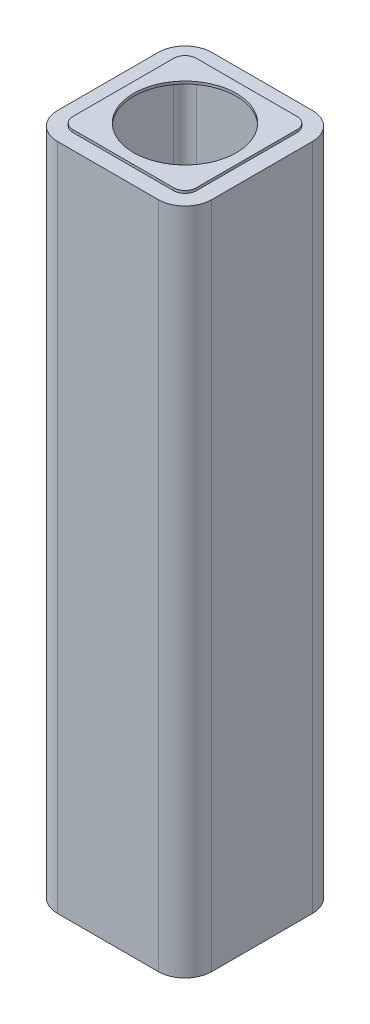
ISO-10303-21;
HEADER;
FILE_DESCRIPTION(('STEP AP214'),'2;1');
FILE_NAME('part.step','',(''),(''),'','','');
FILE_SCHEMA(('AUTOMOTIVE_DESIGN { 1 0 10303 214 1 1 1 1 }'));
ENDSEC;
DATA;
#1=APPLICATION_CONTEXT('core data for automotive mechanical design processes');
#2=APPLICATION_PROTOCOL_DEFINITION('international standard','automotive_design',2000,#1);
#3=PRODUCT_CONTEXT('',#1,'mechanical');
#4=PRODUCT('Part','Part','',(#3));
#5=PRODUCT_RELATED_PRODUCT_CATEGORY('part','',(#4));
#6=PRODUCT_DEFINITION_FORMATION('','',#4);
#7=PRODUCT_DEFINITION_CONTEXT('part definition',#1,'design');
#8=PRODUCT_DEFINITION('design','',#6,#7);
#9=PRODUCT_DEFINITION_SHAPE('','',#8);
#10=(LENGTH_UNIT() NAMED_UNIT(*) SI_UNIT(.MILLI.,.METRE.));
#11=(NAMED_UNIT(*) PLANE_ANGLE_UNIT() SI_UNIT($,.RADIAN.));
#12=(NAMED_UNIT(*) SI_UNIT($,.STERADIAN.) SOLID_ANGLE_UNIT());
#13=UNCERTAINTY_MEASURE_WITH_UNIT(LENGTH_MEASURE(1.E-05),#10,'distance_accuracy_value','');
#14=(GEOMETRIC_REPRESENTATION_CONTEXT(3) GLOBAL_UNCERTAINTY_ASSIGNED_CONTEXT((#13)) GLOBAL_UNIT_ASSIGNED_CONTEXT((#10,
#11,#12)) REPRESENTATION_CONTEXT('',''));
#15=CARTESIAN_POINT('',(0.,0.,0.));
#16=DIRECTION('',(0.,0.,1.));
#17=DIRECTION('',(1.,0.,0.));
#18=AXIS2_PLACEMENT_3D('',#15,#16,#17);
#19=CARTESIAN_POINT('',(9.8,130.5,9.8));
#20=DIRECTION('',(0.,1.,0.));
#21=DIRECTION('',(0.,0.,1.));
#22=AXIS2_PLACEMENT_3D('',#19,#20,#21);
#23=PLANE('',#22);
#24=CARTESIAN_POINT('',(9.8,130.5,9.8));
#25=DIRECTION('',(0.,1.,0.));
#26=DIRECTION('',(0.,0.,1.));
#27=AXIS2_PLACEMENT_3D('',#24,#25,#26);
#28=CIRCLE('',#27,2.2);
#29=CARTESIAN_POINT('',(9.8,130.5,12.));
#30=VERTEX_POINT('',#29);
#31=CARTESIAN_POINT('',(12.,130.5,9.8));
#32=VERTEX_POINT('',#31);
#33=EDGE_CURVE('E195',#30,#32,#28,.T.);
#34=ORIENTED_EDGE('',*,*,#33,.T.);
#35=DIRECTION('',(0.,0.,-1.));
#36=VECTOR('',#35,1.);
#37=CARTESIAN_POINT('',(12.,130.5,9.8));
#38=LINE('',#37,#36);
#39=CARTESIAN_POINT('',(12.,130.5,-9.8));
#40=VERTEX_POINT('',#39);
#41=EDGE_CURVE('E143',#32,#40,#38,.T.);
#42=ORIENTED_EDGE('',*,*,#41,.T.);
#43=CARTESIAN_POINT('',(9.8,130.5,-9.8));
#44=DIRECTION('',(0.,1.,0.));
#45=DIRECTION('',(0.,0.,1.));
#46=AXIS2_PLACEMENT_3D('',#43,#44,#45);
#47=CIRCLE('',#46,2.2);
#48=CARTESIAN_POINT('',(9.8,130.5,-12.));
#49=VERTEX_POINT('',#48);
#50=EDGE_CURVE('E210',#40,#49,#47,.T.);
#51=ORIENTED_EDGE('',*,*,#50,.T.);
#52=DIRECTION('',(-1.,0.,0.));
#53=VECTOR('',#52,1.);
#54=CARTESIAN_POINT('',(9.8,130.5,-12.));
#55=LINE('',#54,#53);
#56=CARTESIAN_POINT('',(-9.8,130.5,-12.));
#57=VERTEX_POINT('',#56);
#58=EDGE_CURVE('E223',#49,#57,#55,.T.);
#59=ORIENTED_EDGE('',*,*,#58,.T.);
#60=CARTESIAN_POINT('',(-9.8,130.5,-9.8));
#61=DIRECTION('',(0.,1.,0.));
#62=DIRECTION('',(0.,0.,1.));
#63=AXIS2_PLACEMENT_3D('',#60,#61,#62);
#64=CIRCLE('',#63,2.2);
#65=CARTESIAN_POINT('',(-12.,130.5,-9.8));
#66=VERTEX_POINT('',#65);
#67=EDGE_CURVE('E162',#57,#66,#64,.T.);
#68=ORIENTED_EDGE('',*,*,#67,.T.);
#69=DIRECTION('',(0.,0.,1.));
#70=VECTOR('',#69,1.);
#71=CARTESIAN_POINT('',(-12.,130.5,-9.8));
#72=LINE('',#71,#70);
#73=CARTESIAN_POINT('',(-12.,130.5,9.8));
#74=VERTEX_POINT('',#73);
#75=EDGE_CURVE('E156',#66,#74,#72,.T.);
#76=ORIENTED_EDGE('',*,*,#75,.T.);
#77=CARTESIAN_POINT('',(-9.8,130.5,9.8));
#78=DIRECTION('',(0.,1.,0.));
#79=DIRECTION('',(0.,0.,1.));
#80=AXIS2_PLACEMENT_3D('',#77,#78,#79);
#81=CIRCLE('',#80,2.2);
#82=CARTESIAN_POINT('',(-9.8,130.5,12.));
#83=VERTEX_POINT('',#82);
#84=EDGE_CURVE('E160',#74,#83,#81,.T.);
#85=ORIENTED_EDGE('',*,*,#84,.T.);
#86=DIRECTION('',(1.,0.,0.));
#87=VECTOR('',#86,1.);
#88=CARTESIAN_POINT('',(-9.8,130.5,12.));
#89=LINE('',#88,#87);
#90=EDGE_CURVE('E100',#83,#30,#89,.T.);
#91=ORIENTED_EDGE('',*,*,#90,.T.);
#92=EDGE_LOOP('',(#34,#42,#51,#59,#68,#76,#85,#91));
#93=FACE_BOUND('',#92,.T.);
#94=CARTESIAN_POINT('',(0.,130.5,0.));
#95=DIRECTION('',(0.,1.,0.));
#96=DIRECTION('',(0.,0.,1.));
#97=AXIS2_PLACEMENT_3D('',#94,#95,#96);
#98=CIRCLE('',#97,10.);
#99=CARTESIAN_POINT('',(0.,130.5,10.));
#100=VERTEX_POINT('',#99);
#101=EDGE_CURVE('E184',#100,#100,#98,.T.);
#102=ORIENTED_EDGE('',*,*,#101,.F.);
#103=EDGE_LOOP('',(#102));
#104=FACE_BOUND('',#103,.T.);
#105=ADVANCED_FACE('F83',(#93,#104),#23,.T.);
#106=CARTESIAN_POINT('',(9.8,130.,9.8));
#107=DIRECTION('',(0.,1.,0.));
#108=DIRECTION('',(0.,0.,1.));
#109=AXIS2_PLACEMENT_3D('',#106,#107,#108);
#110=PLANE('',#109);
#111=CARTESIAN_POINT('',(9.8,130.,9.8));
#112=DIRECTION('',(0.,1.,0.));
#113=DIRECTION('',(0.,0.,1.));
#114=AXIS2_PLACEMENT_3D('',#111,#112,#113);
#115=CIRCLE('',#114,2.2);
#116=CARTESIAN_POINT('',(9.8,130.,12.));
#117=VERTEX_POINT('',#116);
#118=CARTESIAN_POINT('',(12.,130.,9.8));
#119=VERTEX_POINT('',#118);
#120=EDGE_CURVE('E180',#117,#119,#115,.T.);
#121=ORIENTED_EDGE('',*,*,#120,.F.);
#122=DIRECTION('',(1.,0.,0.));
#123=VECTOR('',#122,1.);
#124=CARTESIAN_POINT('',(-9.8,130.,12.));
#125=LINE('',#124,#123);
#126=CARTESIAN_POINT('',(-9.8,130.,12.));
#127=VERTEX_POINT('',#126);
#128=EDGE_CURVE('E135',#127,#117,#125,.T.);
#129=ORIENTED_EDGE('',*,*,#128,.F.);
#130=CARTESIAN_POINT('',(-9.8,130.,9.8));
#131=DIRECTION('',(0.,1.,0.));
#132=DIRECTION('',(0.,0.,1.));
#133=AXIS2_PLACEMENT_3D('',#130,#131,#132);
#134=CIRCLE('',#133,2.2);
#135=CARTESIAN_POINT('',(-12.,130.,9.8));
#136=VERTEX_POINT('',#135);
#137=EDGE_CURVE('E129',#136,#127,#134,.T.);
#138=ORIENTED_EDGE('',*,*,#137,.F.);
#139=DIRECTION('',(0.,0.,1.));
#140=VECTOR('',#139,1.);
#141=CARTESIAN_POINT('',(-12.,130.,-9.8));
#142=LINE('',#141,#140);
#143=CARTESIAN_POINT('',(-12.,130.,-9.8));
#144=VERTEX_POINT('',#143);
#145=EDGE_CURVE('E170',#144,#136,#142,.T.);
#146=ORIENTED_EDGE('',*,*,#145,.F.);
#147=CARTESIAN_POINT('',(-9.8,130.,-9.8));
#148=DIRECTION('',(0.,1.,0.));
#149=DIRECTION('',(0.,0.,1.));
#150=AXIS2_PLACEMENT_3D('',#147,#148,#149);
#151=CIRCLE('',#150,2.2);
#152=CARTESIAN_POINT('',(-9.8,130.,-12.));
#153=VERTEX_POINT('',#152);
#154=EDGE_CURVE('E190',#153,#144,#151,.T.);
#155=ORIENTED_EDGE('',*,*,#154,.F.);
#156=DIRECTION('',(-1.,0.,0.));
#157=VECTOR('',#156,1.);
#158=CARTESIAN_POINT('',(9.8,130.,-12.));
#159=LINE('',#158,#157);
#160=CARTESIAN_POINT('',(9.8,130.,-12.));
#161=VERTEX_POINT('',#160);
#162=EDGE_CURVE('E188',#161,#153,#159,.T.);
#163=ORIENTED_EDGE('',*,*,#162,.F.);
#164=CARTESIAN_POINT('',(9.8,130.,-9.8));
#165=DIRECTION('',(0.,1.,0.));
#166=DIRECTION('',(0.,0.,1.));
#167=AXIS2_PLACEMENT_3D('',#164,#165,#166);
#168=CIRCLE('',#167,2.2);
#169=CARTESIAN_POINT('',(12.,130.,-9.8));
#170=VERTEX_POINT('',#169);
#171=EDGE_CURVE('E186',#170,#161,#168,.T.);
#172=ORIENTED_EDGE('',*,*,#171,.F.);
#173=DIRECTION('',(0.,0.,-1.));
#174=VECTOR('',#173,1.);
#175=CARTESIAN_POINT('',(12.,130.,9.8));
#176=LINE('',#175,#174);
#177=EDGE_CURVE('E183',#119,#170,#176,.T.);
#178=ORIENTED_EDGE('',*,*,#177,.F.);
#179=EDGE_LOOP('',(#121,#129,#138,#146,#155,#163,#172,#178));
#180=FACE_BOUND('',#179,.T.);
#181=CARTESIAN_POINT('',(0.,130.,0.));
#182=DIRECTION('',(0.,1.,0.));
#183=DIRECTION('',(0.,0.,1.));
#184=AXIS2_PLACEMENT_3D('',#181,#182,#183);
#185=CIRCLE('',#184,10.);
#186=CARTESIAN_POINT('',(0.,130.,10.));
#187=VERTEX_POINT('',#186);
#188=EDGE_CURVE('E229',#187,#187,#185,.T.);
#189=ORIENTED_EDGE('',*,*,#188,.T.);
#190=EDGE_LOOP('',(#189));
#191=FACE_BOUND('',#190,.T.);
#192=ADVANCED_FACE('F214',(#180,#191),#110,.F.);
#193=CARTESIAN_POINT('',(9.8,130.5,9.8));
#194=DIRECTION('',(0.,-1.,0.));
#195=DIRECTION('',(0.,0.,-1.));
#196=AXIS2_PLACEMENT_3D('',#193,#194,#195);
#197=CYLINDRICAL_SURFACE('',#196,2.2);
#198=ORIENTED_EDGE('',*,*,#120,.T.);
#199=DIRECTION('',(0.,-1.,0.));
#200=VECTOR('',#199,1.);
#201=CARTESIAN_POINT('',(12.,130.5,9.8));
#202=LINE('',#201,#200);
#203=EDGE_CURVE('E13',#32,#119,#202,.T.);
#204=ORIENTED_EDGE('',*,*,#203,.F.);
#205=ORIENTED_EDGE('',*,*,#33,.F.);
#206=DIRECTION('',(0.,-1.,0.));
#207=VECTOR('',#206,1.);
#208=CARTESIAN_POINT('',(9.8,130.5,12.));
#209=LINE('',#208,#207);
#210=EDGE_CURVE('E176',#30,#117,#209,.T.);
#211=ORIENTED_EDGE('',*,*,#210,.T.);
#212=EDGE_LOOP('',(#198,#204,#205,#211));
#213=FACE_BOUND('',#212,.T.);
#214=ADVANCED_FACE('F85',(#213),#197,.T.);
#215=CARTESIAN_POINT('',(12.,130.5,9.8));
#216=DIRECTION('',(-1.,0.,0.));
#217=DIRECTION('',(0.,0.,1.));
#218=AXIS2_PLACEMENT_3D('',#215,#216,#217);
#219=PLANE('',#218);
#220=ORIENTED_EDGE('',*,*,#177,.T.);
#221=DIRECTION('',(0.,-1.,0.));
#222=VECTOR('',#221,1.);
#223=CARTESIAN_POINT('',(12.,130.5,-9.8));
#224=LINE('',#223,#222);
#225=EDGE_CURVE('E92',#40,#170,#224,.T.);
#226=ORIENTED_EDGE('',*,*,#225,.F.);
#227=ORIENTED_EDGE('',*,*,#41,.F.);
#228=ORIENTED_EDGE('',*,*,#203,.T.);
#229=EDGE_LOOP('',(#220,#226,#227,#228));
#230=FACE_BOUND('',#229,.T.);
#231=ADVANCED_FACE('F257',(#230),#219,.F.);
#232=CARTESIAN_POINT('',(9.8,130.5,-9.8));
#233=DIRECTION('',(0.,-1.,0.));
#234=DIRECTION('',(0.,0.,-1.));
#235=AXIS2_PLACEMENT_3D('',#232,#233,#234);
#236=CYLINDRICAL_SURFACE('',#235,2.2);
#237=ORIENTED_EDGE('',*,*,#171,.T.);
#238=DIRECTION('',(0.,-1.,0.));
#239=VECTOR('',#238,1.);
#240=CARTESIAN_POINT('',(9.8,130.5,-12.));
#241=LINE('',#240,#239);
#242=EDGE_CURVE('E202',#49,#161,#241,.T.);
#243=ORIENTED_EDGE('',*,*,#242,.F.);
#244=ORIENTED_EDGE('',*,*,#50,.F.);
#245=ORIENTED_EDGE('',*,*,#225,.T.);
#246=EDGE_LOOP('',(#237,#243,#244,#245));
#247=FACE_BOUND('',#246,.T.);
#248=ADVANCED_FACE('F208',(#247),#236,.T.);
#249=CARTESIAN_POINT('',(9.8,130.5,-12.));
#250=DIRECTION('',(0.,0.,1.));
#251=DIRECTION('',(0.,-1.,0.));
#252=AXIS2_PLACEMENT_3D('',#249,#250,#251);
#253=PLANE('',#252);
#254=ORIENTED_EDGE('',*,*,#162,.T.);
#255=DIRECTION('',(0.,-1.,0.));
#256=VECTOR('',#255,1.);
#257=CARTESIAN_POINT('',(-9.8,130.5,-12.));
#258=LINE('',#257,#256);
#259=EDGE_CURVE('E199',#57,#153,#258,.T.);
#260=ORIENTED_EDGE('',*,*,#259,.F.);
#261=ORIENTED_EDGE('',*,*,#58,.F.);
#262=ORIENTED_EDGE('',*,*,#242,.T.);
#263=EDGE_LOOP('',(#254,#260,#261,#262));
#264=FACE_BOUND('',#263,.T.);
#265=ADVANCED_FACE('F219',(#264),#253,.F.);
#266=CARTESIAN_POINT('',(-9.8,130.5,-9.8));
#267=DIRECTION('',(0.,-1.,0.));
#268=DIRECTION('',(0.,0.,-1.));
#269=AXIS2_PLACEMENT_3D('',#266,#267,#268);
#270=CYLINDRICAL_SURFACE('',#269,2.2);
#271=ORIENTED_EDGE('',*,*,#154,.T.);
#272=DIRECTION('',(0.,-1.,0.));
#273=VECTOR('',#272,1.);
#274=CARTESIAN_POINT('',(-12.,130.5,-9.8));
#275=LINE('',#274,#273);
#276=EDGE_CURVE('E171',#66,#144,#275,.T.);
#277=ORIENTED_EDGE('',*,*,#276,.F.);
#278=ORIENTED_EDGE('',*,*,#67,.F.);
#279=ORIENTED_EDGE('',*,*,#259,.T.);
#280=EDGE_LOOP('',(#271,#277,#278,#279));
#281=FACE_BOUND('',#280,.T.);
#282=ADVANCED_FACE('F222',(#281),#270,.T.);
#283=CARTESIAN_POINT('',(-12.,130.5,-9.8));
#284=DIRECTION('',(1.,0.,0.));
#285=DIRECTION('',(0.,0.,-1.));
#286=AXIS2_PLACEMENT_3D('',#283,#284,#285);
#287=PLANE('',#286);
#288=ORIENTED_EDGE('',*,*,#145,.T.);
#289=DIRECTION('',(0.,-1.,0.));
#290=VECTOR('',#289,1.);
#291=CARTESIAN_POINT('',(-12.,130.5,9.8));
#292=LINE('',#291,#290);
#293=EDGE_CURVE('E167',#74,#136,#292,.T.);
#294=ORIENTED_EDGE('',*,*,#293,.F.);
#295=ORIENTED_EDGE('',*,*,#75,.F.);
#296=ORIENTED_EDGE('',*,*,#276,.T.);
#297=EDGE_LOOP('',(#288,#294,#295,#296));
#298=FACE_BOUND('',#297,.T.);
#299=ADVANCED_FACE('F168',(#298),#287,.F.);
#300=CARTESIAN_POINT('',(-9.8,130.5,9.8));
#301=DIRECTION('',(0.,-1.,0.));
#302=DIRECTION('',(0.,0.,-1.));
#303=AXIS2_PLACEMENT_3D('',#300,#301,#302);
#304=CYLINDRICAL_SURFACE('',#303,2.2);
#305=ORIENTED_EDGE('',*,*,#137,.T.);
#306=DIRECTION('',(0.,-1.,0.));
#307=VECTOR('',#306,1.);
#308=CARTESIAN_POINT('',(-9.8,130.5,12.));
#309=LINE('',#308,#307);
#310=EDGE_CURVE('E172',#83,#127,#309,.T.);
#311=ORIENTED_EDGE('',*,*,#310,.F.);
#312=ORIENTED_EDGE('',*,*,#84,.F.);
#313=ORIENTED_EDGE('',*,*,#293,.T.);
#314=EDGE_LOOP('',(#305,#311,#312,#313));
#315=FACE_BOUND('',#314,.T.);
#316=ADVANCED_FACE('F174',(#315),#304,.T.);
#317=CARTESIAN_POINT('',(-9.8,130.5,12.));
#318=DIRECTION('',(0.,0.,-1.));
#319=DIRECTION('',(-1.,0.,0.));
#320=AXIS2_PLACEMENT_3D('',#317,#318,#319);
#321=PLANE('',#320);
#322=ORIENTED_EDGE('',*,*,#128,.T.);
#323=ORIENTED_EDGE('',*,*,#210,.F.);
#324=ORIENTED_EDGE('',*,*,#90,.F.);
#325=ORIENTED_EDGE('',*,*,#310,.T.);
#326=EDGE_LOOP('',(#322,#323,#324,#325));
#327=FACE_BOUND('',#326,.T.);
#328=ADVANCED_FACE('F245',(#327),#321,.F.);
#329=CARTESIAN_POINT('',(0.,130.5,0.));
#330=DIRECTION('',(0.,-1.,0.));
#331=DIRECTION('',(0.,0.,-1.));
#332=AXIS2_PLACEMENT_3D('',#329,#330,#331);
#333=CYLINDRICAL_SURFACE('',#332,10.);
#334=ORIENTED_EDGE('',*,*,#101,.T.);
#335=EDGE_LOOP('',(#334));
#336=FACE_BOUND('',#335,.T.);
#337=ORIENTED_EDGE('',*,*,#188,.F.);
#338=EDGE_LOOP('',(#337));
#339=FACE_BOUND('',#338,.T.);
#340=ADVANCED_FACE('F235',(#336,#339),#333,.F.);
#341=CLOSED_SHELL('',(#105,#192,#214,#231,#248,#265,#282,#299,#316,#328,#340));
#342=MANIFOLD_SOLID_BREP('B2',#341);
#343=CARTESIAN_POINT('',(9.8,130.,-9.8));
#344=DIRECTION('',(0.,-1.,0.));
#345=DIRECTION('',(0.,0.,-1.));
#346=AXIS2_PLACEMENT_3D('',#343,#344,#345);
#347=CYLINDRICAL_SURFACE('',#346,5.2);
#348=CARTESIAN_POINT('',(9.8,0.,-9.8));
#349=DIRECTION('',(0.,1.,0.));
#350=DIRECTION('',(0.,0.,1.));
#351=AXIS2_PLACEMENT_3D('',#348,#349,#350);
#352=CIRCLE('',#351,5.2);
#353=CARTESIAN_POINT('',(15.,0.,-9.8));
#354=VERTEX_POINT('',#353);
#355=CARTESIAN_POINT('',(9.8,0.,-15.));
#356=VERTEX_POINT('',#355);
#357=EDGE_CURVE('E517',#354,#356,#352,.T.);
#358=ORIENTED_EDGE('',*,*,#357,.T.);
#359=DIRECTION('',(0.,-1.,0.));
#360=VECTOR('',#359,1.);
#361=CARTESIAN_POINT('',(9.8,130.,-15.));
#362=LINE('',#361,#360);
#363=CARTESIAN_POINT('',(9.8,130.,-15.));
#364=VERTEX_POINT('',#363);
#365=EDGE_CURVE('E81',#364,#356,#362,.T.);
#366=ORIENTED_EDGE('',*,*,#365,.F.);
#367=CARTESIAN_POINT('',(9.8,130.,-9.8));
#368=DIRECTION('',(0.,1.,0.));
#369=DIRECTION('',(0.,0.,1.));
#370=AXIS2_PLACEMENT_3D('',#367,#368,#369);
#371=CIRCLE('',#370,5.2);
#372=CARTESIAN_POINT('',(15.,130.,-9.8));
#373=VERTEX_POINT('',#372);
#374=EDGE_CURVE('E623',#373,#364,#371,.T.);
#375=ORIENTED_EDGE('',*,*,#374,.F.);
#376=DIRECTION('',(0.,-1.,0.));
#377=VECTOR('',#376,1.);
#378=CARTESIAN_POINT('',(15.,130.,-9.8));
#379=LINE('',#378,#377);
#380=EDGE_CURVE('E540',#373,#354,#379,.T.);
#381=ORIENTED_EDGE('',*,*,#380,.T.);
#382=EDGE_LOOP('',(#358,#366,#375,#381));
#383=FACE_BOUND('',#382,.T.);
#384=ADVANCED_FACE('F332',(#383),#347,.T.);
#385=CARTESIAN_POINT('',(9.8,130.,-15.));
#386=DIRECTION('',(0.,0.,1.));
#387=DIRECTION('',(1.,0.,0.));
#388=AXIS2_PLACEMENT_3D('',#385,#386,#387);
#389=PLANE('',#388);
#390=DIRECTION('',(-1.,0.,0.));
#391=VECTOR('',#390,1.);
#392=CARTESIAN_POINT('',(9.8,0.,-15.));
#393=LINE('',#392,#391);
#394=CARTESIAN_POINT('',(-9.8,0.,-15.));
#395=VERTEX_POINT('',#394);
#396=EDGE_CURVE('E521',#356,#395,#393,.T.);
#397=ORIENTED_EDGE('',*,*,#396,.T.);
#398=DIRECTION('',(0.,-1.,0.));
#399=VECTOR('',#398,1.);
#400=CARTESIAN_POINT('',(-9.8,130.,-15.));
#401=LINE('',#400,#399);
#402=CARTESIAN_POINT('',(-9.8,130.,-15.));
#403=VERTEX_POINT('',#402);
#404=EDGE_CURVE('E343',#403,#395,#401,.T.);
#405=ORIENTED_EDGE('',*,*,#404,.F.);
#406=DIRECTION('',(-1.,0.,0.));
#407=VECTOR('',#406,1.);
#408=CARTESIAN_POINT('',(9.8,130.,-15.));
#409=LINE('',#408,#407);
#410=EDGE_CURVE('E626',#364,#403,#409,.T.);
#411=ORIENTED_EDGE('',*,*,#410,.F.);
#412=ORIENTED_EDGE('',*,*,#365,.T.);
#413=EDGE_LOOP('',(#397,#405,#411,#412));
#414=FACE_BOUND('',#413,.T.);
#415=ADVANCED_FACE('F665',(#414),#389,.F.);
#416=CARTESIAN_POINT('',(-9.8,130.,-9.8));
#417=DIRECTION('',(0.,-1.,0.));
#418=DIRECTION('',(0.,0.,-1.));
#419=AXIS2_PLACEMENT_3D('',#416,#417,#418);
#420=CYLINDRICAL_SURFACE('',#419,5.2);
#421=CARTESIAN_POINT('',(-9.8,0.,-9.8));
#422=DIRECTION('',(0.,1.,0.));
#423=DIRECTION('',(0.,0.,1.));
#424=AXIS2_PLACEMENT_3D('',#421,#422,#423);
#425=CIRCLE('',#424,5.2);
#426=CARTESIAN_POINT('',(-15.,0.,-9.8));
#427=VERTEX_POINT('',#426);
#428=EDGE_CURVE('E524',#395,#427,#425,.T.);
#429=ORIENTED_EDGE('',*,*,#428,.T.);
#430=DIRECTION('',(0.,-1.,0.));
#431=VECTOR('',#430,1.);
#432=CARTESIAN_POINT('',(-15.,130.,-9.8));
#433=LINE('',#432,#431);
#434=CARTESIAN_POINT('',(-15.,130.,-9.8));
#435=VERTEX_POINT('',#434);
#436=EDGE_CURVE('E551',#435,#427,#433,.T.);
#437=ORIENTED_EDGE('',*,*,#436,.F.);
#438=CARTESIAN_POINT('',(-9.8,130.,-9.8));
#439=DIRECTION('',(0.,1.,0.));
#440=DIRECTION('',(0.,0.,1.));
#441=AXIS2_PLACEMENT_3D('',#438,#439,#440);
#442=CIRCLE('',#441,5.2);
#443=EDGE_CURVE('E629',#403,#435,#442,.T.);
#444=ORIENTED_EDGE('',*,*,#443,.F.);
#445=ORIENTED_EDGE('',*,*,#404,.T.);
#446=EDGE_LOOP('',(#429,#437,#444,#445));
#447=FACE_BOUND('',#446,.T.);
#448=ADVANCED_FACE('F670',(#447),#420,.T.);
#449=CARTESIAN_POINT('',(-15.,130.,9.8));
#450=DIRECTION('',(1.,0.,0.));
#451=DIRECTION('',(0.,0.,-1.));
#452=AXIS2_PLACEMENT_3D('',#449,#450,#451);
#453=PLANE('',#452);
#454=DIRECTION('',(0.,0.,1.));
#455=VECTOR('',#454,1.);
#456=CARTESIAN_POINT('',(-15.,0.,9.8));
#457=LINE('',#456,#455);
#458=CARTESIAN_POINT('',(-15.,0.,9.8));
#459=VERTEX_POINT('',#458);
#460=EDGE_CURVE('E527',#427,#459,#457,.T.);
#461=ORIENTED_EDGE('',*,*,#460,.T.);
#462=DIRECTION('',(0.,-1.,0.));
#463=VECTOR('',#462,1.);
#464=CARTESIAN_POINT('',(-15.,130.,9.8));
#465=LINE('',#464,#463);
#466=CARTESIAN_POINT('',(-15.,130.,9.8));
#467=VERTEX_POINT('',#466);
#468=EDGE_CURVE('E547',#467,#459,#465,.T.);
#469=ORIENTED_EDGE('',*,*,#468,.F.);
#470=DIRECTION('',(0.,0.,1.));
#471=VECTOR('',#470,1.);
#472=CARTESIAN_POINT('',(-15.,130.,9.8));
#473=LINE('',#472,#471);
#474=EDGE_CURVE('E632',#435,#467,#473,.T.);
#475=ORIENTED_EDGE('',*,*,#474,.F.);
#476=ORIENTED_EDGE('',*,*,#436,.T.);
#477=EDGE_LOOP('',(#461,#469,#475,#476));
#478=FACE_BOUND('',#477,.T.);
#479=ADVANCED_FACE('F640',(#478),#453,.F.);
#480=CARTESIAN_POINT('',(-9.8,130.,9.8));
#481=DIRECTION('',(0.,-1.,0.));
#482=DIRECTION('',(0.,0.,-1.));
#483=AXIS2_PLACEMENT_3D('',#480,#481,#482);
#484=CYLINDRICAL_SURFACE('',#483,5.2);
#485=CARTESIAN_POINT('',(-9.8,0.,9.8));
#486=DIRECTION('',(0.,1.,0.));
#487=DIRECTION('',(0.,0.,1.));
#488=AXIS2_PLACEMENT_3D('',#485,#486,#487);
#489=CIRCLE('',#488,5.2);
#490=CARTESIAN_POINT('',(-9.8,0.,15.));
#491=VERTEX_POINT('',#490);
#492=EDGE_CURVE('E530',#459,#491,#489,.T.);
#493=ORIENTED_EDGE('',*,*,#492,.T.);
#494=DIRECTION('',(0.,-1.,0.));
#495=VECTOR('',#494,1.);
#496=CARTESIAN_POINT('',(-9.8,130.,15.));
#497=LINE('',#496,#495);
#498=CARTESIAN_POINT('',(-9.8,130.,15.));
#499=VERTEX_POINT('',#498);
#500=EDGE_CURVE('E474',#499,#491,#497,.T.);
#501=ORIENTED_EDGE('',*,*,#500,.F.);
#502=CARTESIAN_POINT('',(-9.8,130.,9.8));
#503=DIRECTION('',(0.,1.,0.));
#504=DIRECTION('',(0.,0.,1.));
#505=AXIS2_PLACEMENT_3D('',#502,#503,#504);
#506=CIRCLE('',#505,5.2);
#507=EDGE_CURVE('E463',#467,#499,#506,.T.);
#508=ORIENTED_EDGE('',*,*,#507,.F.);
#509=ORIENTED_EDGE('',*,*,#468,.T.);
#510=EDGE_LOOP('',(#493,#501,#508,#509));
#511=FACE_BOUND('',#510,.T.);
#512=ADVANCED_FACE('F644',(#511),#484,.T.);
#513=CARTESIAN_POINT('',(-9.8,130.,15.));
#514=DIRECTION('',(0.,0.,-1.));
#515=DIRECTION('',(-1.,0.,0.));
#516=AXIS2_PLACEMENT_3D('',#513,#514,#515);
#517=PLANE('',#516);
#518=DIRECTION('',(1.,0.,0.));
#519=VECTOR('',#518,1.);
#520=CARTESIAN_POINT('',(-9.8,0.,15.));
#521=LINE('',#520,#519);
#522=CARTESIAN_POINT('',(9.8,0.,15.));
#523=VERTEX_POINT('',#522);
#524=EDGE_CURVE('E472',#491,#523,#521,.T.);
#525=ORIENTED_EDGE('',*,*,#524,.T.);
#526=DIRECTION('',(0.,-1.,0.));
#527=VECTOR('',#526,1.);
#528=CARTESIAN_POINT('',(9.8,130.,15.));
#529=LINE('',#528,#527);
#530=CARTESIAN_POINT('',(9.8,130.,15.));
#531=VERTEX_POINT('',#530);
#532=EDGE_CURVE('E469',#531,#523,#529,.T.);
#533=ORIENTED_EDGE('',*,*,#532,.F.);
#534=DIRECTION('',(1.,0.,0.));
#535=VECTOR('',#534,1.);
#536=CARTESIAN_POINT('',(-9.8,130.,15.));
#537=LINE('',#536,#535);
#538=EDGE_CURVE('E457',#499,#531,#537,.T.);
#539=ORIENTED_EDGE('',*,*,#538,.F.);
#540=ORIENTED_EDGE('',*,*,#500,.T.);
#541=EDGE_LOOP('',(#525,#533,#539,#540));
#542=FACE_BOUND('',#541,.T.);
#543=ADVANCED_FACE('F470',(#542),#517,.F.);
#544=CARTESIAN_POINT('',(9.8,130.,9.8));
#545=DIRECTION('',(0.,-1.,0.));
#546=DIRECTION('',(0.,0.,-1.));
#547=AXIS2_PLACEMENT_3D('',#544,#545,#546);
#548=CYLINDRICAL_SURFACE('',#547,5.2);
#549=CARTESIAN_POINT('',(9.8,0.,9.8));
#550=DIRECTION('',(0.,1.,0.));
#551=DIRECTION('',(0.,0.,1.));
#552=AXIS2_PLACEMENT_3D('',#549,#550,#551);
#553=CIRCLE('',#552,5.2);
#554=CARTESIAN_POINT('',(15.,0.,9.8));
#555=VERTEX_POINT('',#554);
#556=EDGE_CURVE('E405',#523,#555,#553,.T.);
#557=ORIENTED_EDGE('',*,*,#556,.T.);
#558=DIRECTION('',(0.,-1.,0.));
#559=VECTOR('',#558,1.);
#560=CARTESIAN_POINT('',(15.,130.,9.8));
#561=LINE('',#560,#559);
#562=CARTESIAN_POINT('',(15.,130.,9.8));
#563=VERTEX_POINT('',#562);
#564=EDGE_CURVE('E475',#563,#555,#561,.T.);
#565=ORIENTED_EDGE('',*,*,#564,.F.);
#566=CARTESIAN_POINT('',(9.8,130.,9.8));
#567=DIRECTION('',(0.,1.,0.));
#568=DIRECTION('',(0.,0.,1.));
#569=AXIS2_PLACEMENT_3D('',#566,#567,#568);
#570=CIRCLE('',#569,5.2);
#571=EDGE_CURVE('E461',#531,#563,#570,.T.);
#572=ORIENTED_EDGE('',*,*,#571,.F.);
#573=ORIENTED_EDGE('',*,*,#532,.T.);
#574=EDGE_LOOP('',(#557,#565,#572,#573));
#575=FACE_BOUND('',#574,.T.);
#576=ADVANCED_FACE('F477',(#575),#548,.T.);
#577=CARTESIAN_POINT('',(-9.8,130.,-9.8));
#578=DIRECTION('',(0.,-1.,0.));
#579=DIRECTION('',(0.,0.,-1.));
#580=AXIS2_PLACEMENT_3D('',#577,#578,#579);
#581=CYLINDRICAL_SURFACE('',#580,2.2);
#582=CARTESIAN_POINT('',(-9.8,0.,-9.8));
#583=DIRECTION('',(0.,1.,0.));
#584=DIRECTION('',(0.,0.,1.));
#585=AXIS2_PLACEMENT_3D('',#582,#583,#584);
#586=CIRCLE('',#585,2.2);
#587=CARTESIAN_POINT('',(-9.8,0.,-12.));
#588=VERTEX_POINT('',#587);
#589=CARTESIAN_POINT('',(-12.,0.,-9.8));
#590=VERTEX_POINT('',#589);
#591=EDGE_CURVE('E485',#588,#590,#586,.T.);
#592=ORIENTED_EDGE('',*,*,#591,.F.);
#593=DIRECTION('',(0.,-1.,0.));
#594=VECTOR('',#593,1.);
#595=CARTESIAN_POINT('',(-9.8,130.,-12.));
#596=LINE('',#595,#594);
#597=CARTESIAN_POINT('',(-9.8,130.,-12.));
#598=VERTEX_POINT('',#597);
#599=EDGE_CURVE('E336',#598,#588,#596,.T.);
#600=ORIENTED_EDGE('',*,*,#599,.F.);
#601=CARTESIAN_POINT('',(-9.8,130.,-9.8));
#602=DIRECTION('',(0.,1.,0.));
#603=DIRECTION('',(0.,0.,1.));
#604=AXIS2_PLACEMENT_3D('',#601,#602,#603);
#605=CIRCLE('',#604,2.2);
#606=CARTESIAN_POINT('',(-12.,130.,-9.8));
#607=VERTEX_POINT('',#606);
#608=EDGE_CURVE('E539',#598,#607,#605,.T.);
#609=ORIENTED_EDGE('',*,*,#608,.T.);
#610=DIRECTION('',(0.,-1.,0.));
#611=VECTOR('',#610,1.);
#612=CARTESIAN_POINT('',(-12.,130.,-9.8));
#613=LINE('',#612,#611);
#614=EDGE_CURVE('E481',#607,#590,#613,.T.);
#615=ORIENTED_EDGE('',*,*,#614,.T.);
#616=EDGE_LOOP('',(#592,#600,#609,#615));
#617=FACE_BOUND('',#616,.T.);
#618=ADVANCED_FACE('F334',(#617),#581,.F.);
#619=CARTESIAN_POINT('',(9.8,130.,-12.));
#620=DIRECTION('',(0.,0.,1.));
#621=DIRECTION('',(1.,0.,0.));
#622=AXIS2_PLACEMENT_3D('',#619,#620,#621);
#623=PLANE('',#622);
#624=DIRECTION('',(-1.,0.,0.));
#625=VECTOR('',#624,1.);
#626=CARTESIAN_POINT('',(9.8,0.,-12.));
#627=LINE('',#626,#625);
#628=CARTESIAN_POINT('',(9.8,0.,-12.));
#629=VERTEX_POINT('',#628);
#630=EDGE_CURVE('E489',#629,#588,#627,.T.);
#631=ORIENTED_EDGE('',*,*,#630,.F.);
#632=DIRECTION('',(0.,-1.,0.));
#633=VECTOR('',#632,1.);
#634=CARTESIAN_POINT('',(9.8,130.,-12.));
#635=LINE('',#634,#633);
#636=CARTESIAN_POINT('',(9.8,130.,-12.));
#637=VERTEX_POINT('',#636);
#638=EDGE_CURVE('E574',#637,#629,#635,.T.);
#639=ORIENTED_EDGE('',*,*,#638,.F.);
#640=DIRECTION('',(-1.,0.,0.));
#641=VECTOR('',#640,1.);
#642=CARTESIAN_POINT('',(9.8,130.,-12.));
#643=LINE('',#642,#641);
#644=EDGE_CURVE('E585',#637,#598,#643,.T.);
#645=ORIENTED_EDGE('',*,*,#644,.T.);
#646=ORIENTED_EDGE('',*,*,#599,.T.);
#647=EDGE_LOOP('',(#631,#639,#645,#646));
#648=FACE_BOUND('',#647,.T.);
#649=ADVANCED_FACE('F583',(#648),#623,.T.);
#650=CARTESIAN_POINT('',(9.8,130.,-9.8));
#651=DIRECTION('',(0.,-1.,0.));
#652=DIRECTION('',(0.,0.,-1.));
#653=AXIS2_PLACEMENT_3D('',#650,#651,#652);
#654=CYLINDRICAL_SURFACE('',#653,2.2);
#655=CARTESIAN_POINT('',(9.8,0.,-9.8));
#656=DIRECTION('',(0.,1.,0.));
#657=DIRECTION('',(0.,0.,1.));
#658=AXIS2_PLACEMENT_3D('',#655,#656,#657);
#659=CIRCLE('',#658,2.2);
#660=CARTESIAN_POINT('',(12.,0.,-9.8));
#661=VERTEX_POINT('',#660);
#662=EDGE_CURVE('E493',#661,#629,#659,.T.);
#663=ORIENTED_EDGE('',*,*,#662,.F.);
#664=DIRECTION('',(0.,-1.,0.));
#665=VECTOR('',#664,1.);
#666=CARTESIAN_POINT('',(12.,130.,-9.8));
#667=LINE('',#666,#665);
#668=CARTESIAN_POINT('',(12.,130.,-9.8));
#669=VERTEX_POINT('',#668);
#670=EDGE_CURVE('E572',#669,#661,#667,.T.);
#671=ORIENTED_EDGE('',*,*,#670,.F.);
#672=CARTESIAN_POINT('',(9.8,130.,-9.8));
#673=DIRECTION('',(0.,1.,0.));
#674=DIRECTION('',(0.,0.,1.));
#675=AXIS2_PLACEMENT_3D('',#672,#673,#674);
#676=CIRCLE('',#675,2.2);
#677=EDGE_CURVE('E593',#669,#637,#676,.T.);
#678=ORIENTED_EDGE('',*,*,#677,.T.);
#679=ORIENTED_EDGE('',*,*,#638,.T.);
#680=EDGE_LOOP('',(#663,#671,#678,#679));
#681=FACE_BOUND('',#680,.T.);
#682=ADVANCED_FACE('F591',(#681),#654,.F.);
#683=CARTESIAN_POINT('',(12.,130.,-9.8));
#684=DIRECTION('',(-1.,0.,0.));
#685=DIRECTION('',(0.,0.,1.));
#686=AXIS2_PLACEMENT_3D('',#683,#684,#685);
#687=PLANE('',#686);
#688=DIRECTION('',(0.,0.,-1.));
#689=VECTOR('',#688,1.);
#690=CARTESIAN_POINT('',(12.,0.,-9.8));
#691=LINE('',#690,#689);
#692=CARTESIAN_POINT('',(12.,0.,9.8));
#693=VERTEX_POINT('',#692);
#694=EDGE_CURVE('E497',#693,#661,#691,.T.);
#695=ORIENTED_EDGE('',*,*,#694,.F.);
#696=DIRECTION('',(0.,-1.,0.));
#697=VECTOR('',#696,1.);
#698=CARTESIAN_POINT('',(12.,130.,9.8));
#699=LINE('',#698,#697);
#700=CARTESIAN_POINT('',(12.,130.,9.8));
#701=VERTEX_POINT('',#700);
#702=EDGE_CURVE('E569',#701,#693,#699,.T.);
#703=ORIENTED_EDGE('',*,*,#702,.F.);
#704=DIRECTION('',(0.,0.,-1.));
#705=VECTOR('',#704,1.);
#706=CARTESIAN_POINT('',(12.,130.,-9.8));
#707=LINE('',#706,#705);
#708=EDGE_CURVE('E599',#701,#669,#707,.T.);
#709=ORIENTED_EDGE('',*,*,#708,.T.);
#710=ORIENTED_EDGE('',*,*,#670,.T.);
#711=EDGE_LOOP('',(#695,#703,#709,#710));
#712=FACE_BOUND('',#711,.T.);
#713=ADVANCED_FACE('F603',(#712),#687,.T.);
#714=CARTESIAN_POINT('',(9.8,130.,9.8));
#715=DIRECTION('',(0.,-1.,0.));
#716=DIRECTION('',(0.,0.,-1.));
#717=AXIS2_PLACEMENT_3D('',#714,#715,#716);
#718=CYLINDRICAL_SURFACE('',#717,2.2);
#719=CARTESIAN_POINT('',(9.8,0.,9.8));
#720=DIRECTION('',(0.,1.,0.));
#721=DIRECTION('',(0.,0.,1.));
#722=AXIS2_PLACEMENT_3D('',#719,#720,#721);
#723=CIRCLE('',#722,2.2);
#724=CARTESIAN_POINT('',(9.8,0.,12.));
#725=VERTEX_POINT('',#724);
#726=EDGE_CURVE('E501',#725,#693,#723,.T.);
#727=ORIENTED_EDGE('',*,*,#726,.F.);
#728=DIRECTION('',(0.,-1.,0.));
#729=VECTOR('',#728,1.);
#730=CARTESIAN_POINT('',(9.8,130.,12.));
#731=LINE('',#730,#729);
#732=CARTESIAN_POINT('',(9.8,130.,12.));
#733=VERTEX_POINT('',#732);
#734=EDGE_CURVE('E566',#733,#725,#731,.T.);
#735=ORIENTED_EDGE('',*,*,#734,.F.);
#736=CARTESIAN_POINT('',(9.8,130.,9.8));
#737=DIRECTION('',(0.,1.,0.));
#738=DIRECTION('',(0.,0.,1.));
#739=AXIS2_PLACEMENT_3D('',#736,#737,#738);
#740=CIRCLE('',#739,2.2);
#741=EDGE_CURVE('E605',#733,#701,#740,.T.);
#742=ORIENTED_EDGE('',*,*,#741,.T.);
#743=ORIENTED_EDGE('',*,*,#702,.T.);
#744=EDGE_LOOP('',(#727,#735,#742,#743));
#745=FACE_BOUND('',#744,.T.);
#746=ADVANCED_FACE('F681',(#745),#718,.F.);
#747=CARTESIAN_POINT('',(-9.8,130.,12.));
#748=DIRECTION('',(0.,0.,-1.));
#749=DIRECTION('',(-1.,0.,0.));
#750=AXIS2_PLACEMENT_3D('',#747,#748,#749);
#751=PLANE('',#750);
#752=DIRECTION('',(1.,0.,0.));
#753=VECTOR('',#752,1.);
#754=CARTESIAN_POINT('',(-9.8,0.,12.));
#755=LINE('',#754,#753);
#756=CARTESIAN_POINT('',(-9.8,0.,12.));
#757=VERTEX_POINT('',#756);
#758=EDGE_CURVE('E505',#757,#725,#755,.T.);
#759=ORIENTED_EDGE('',*,*,#758,.F.);
#760=DIRECTION('',(0.,-1.,0.));
#761=VECTOR('',#760,1.);
#762=CARTESIAN_POINT('',(-9.8,130.,12.));
#763=LINE('',#762,#761);
#764=CARTESIAN_POINT('',(-9.8,130.,12.));
#765=VERTEX_POINT('',#764);
#766=EDGE_CURVE('E563',#765,#757,#763,.T.);
#767=ORIENTED_EDGE('',*,*,#766,.F.);
#768=DIRECTION('',(1.,0.,0.));
#769=VECTOR('',#768,1.);
#770=CARTESIAN_POINT('',(-9.8,130.,12.));
#771=LINE('',#770,#769);
#772=EDGE_CURVE('E608',#765,#733,#771,.T.);
#773=ORIENTED_EDGE('',*,*,#772,.T.);
#774=ORIENTED_EDGE('',*,*,#734,.T.);
#775=EDGE_LOOP('',(#759,#767,#773,#774));
#776=FACE_BOUND('',#775,.T.);
#777=ADVANCED_FACE('F677',(#776),#751,.T.);
#778=CARTESIAN_POINT('',(-9.8,130.,9.8));
#779=DIRECTION('',(0.,-1.,0.));
#780=DIRECTION('',(0.,0.,-1.));
#781=AXIS2_PLACEMENT_3D('',#778,#779,#780);
#782=CYLINDRICAL_SURFACE('',#781,2.2);
#783=CARTESIAN_POINT('',(-9.8,0.,9.8));
#784=DIRECTION('',(0.,1.,0.));
#785=DIRECTION('',(0.,0.,1.));
#786=AXIS2_PLACEMENT_3D('',#783,#784,#785);
#787=CIRCLE('',#786,2.2);
#788=CARTESIAN_POINT('',(-12.,0.,9.8));
#789=VERTEX_POINT('',#788);
#790=EDGE_CURVE('E509',#789,#757,#787,.T.);
#791=ORIENTED_EDGE('',*,*,#790,.F.);
#792=DIRECTION('',(0.,-1.,0.));
#793=VECTOR('',#792,1.);
#794=CARTESIAN_POINT('',(-12.,130.,9.8));
#795=LINE('',#794,#793);
#796=CARTESIAN_POINT('',(-12.,130.,9.8));
#797=VERTEX_POINT('',#796);
#798=EDGE_CURVE('E560',#797,#789,#795,.T.);
#799=ORIENTED_EDGE('',*,*,#798,.F.);
#800=CARTESIAN_POINT('',(-9.8,130.,9.8));
#801=DIRECTION('',(0.,1.,0.));
#802=DIRECTION('',(0.,0.,1.));
#803=AXIS2_PLACEMENT_3D('',#800,#801,#802);
#804=CIRCLE('',#803,2.2);
#805=EDGE_CURVE('E615',#797,#765,#804,.T.);
#806=ORIENTED_EDGE('',*,*,#805,.T.);
#807=ORIENTED_EDGE('',*,*,#766,.T.);
#808=EDGE_LOOP('',(#791,#799,#806,#807));
#809=FACE_BOUND('',#808,.T.);
#810=ADVANCED_FACE('F659',(#809),#782,.F.);
#811=CARTESIAN_POINT('',(-12.,130.,9.8));
#812=DIRECTION('',(1.,0.,0.));
#813=DIRECTION('',(0.,0.,-1.));
#814=AXIS2_PLACEMENT_3D('',#811,#812,#813);
#815=PLANE('',#814);
#816=DIRECTION('',(0.,0.,1.));
#817=VECTOR('',#816,1.);
#818=CARTESIAN_POINT('',(-12.,0.,9.8));
#819=LINE('',#818,#817);
#820=EDGE_CURVE('E513',#590,#789,#819,.T.);
#821=ORIENTED_EDGE('',*,*,#820,.F.);
#822=ORIENTED_EDGE('',*,*,#614,.F.);
#823=DIRECTION('',(0.,0.,1.));
#824=VECTOR('',#823,1.);
#825=CARTESIAN_POINT('',(-12.,130.,9.8));
#826=LINE('',#825,#824);
#827=EDGE_CURVE('E619',#607,#797,#826,.T.);
#828=ORIENTED_EDGE('',*,*,#827,.T.);
#829=ORIENTED_EDGE('',*,*,#798,.T.);
#830=EDGE_LOOP('',(#821,#822,#828,#829));
#831=FACE_BOUND('',#830,.T.);
#832=ADVANCED_FACE('F652',(#831),#815,.T.);
#833=CARTESIAN_POINT('',(15.,130.,-9.8));
#834=DIRECTION('',(-1.,0.,0.));
#835=DIRECTION('',(0.,0.,1.));
#836=AXIS2_PLACEMENT_3D('',#833,#834,#835);
#837=PLANE('',#836);
#838=DIRECTION('',(0.,0.,-1.));
#839=VECTOR('',#838,1.);
#840=CARTESIAN_POINT('',(15.,0.,-9.8));
#841=LINE('',#840,#839);
#842=EDGE_CURVE('E411',#555,#354,#841,.T.);
#843=ORIENTED_EDGE('',*,*,#842,.T.);
#844=ORIENTED_EDGE('',*,*,#380,.F.);
#845=DIRECTION('',(0.,0.,-1.));
#846=VECTOR('',#845,1.);
#847=CARTESIAN_POINT('',(15.,130.,-9.8));
#848=LINE('',#847,#846);
#849=EDGE_CURVE('E352',#563,#373,#848,.T.);
#850=ORIENTED_EDGE('',*,*,#849,.F.);
#851=ORIENTED_EDGE('',*,*,#564,.T.);
#852=EDGE_LOOP('',(#843,#844,#850,#851));
#853=FACE_BOUND('',#852,.T.);
#854=ADVANCED_FACE('F650',(#853),#837,.F.);
#855=CARTESIAN_POINT('',(9.8,130.,-9.8));
#856=DIRECTION('',(0.,1.,0.));
#857=DIRECTION('',(0.,0.,1.));
#858=AXIS2_PLACEMENT_3D('',#855,#856,#857);
#859=PLANE('',#858);
#860=ORIENTED_EDGE('',*,*,#608,.F.);
#861=ORIENTED_EDGE('',*,*,#644,.F.);
#862=ORIENTED_EDGE('',*,*,#677,.F.);
#863=ORIENTED_EDGE('',*,*,#708,.F.);
#864=ORIENTED_EDGE('',*,*,#741,.F.);
#865=ORIENTED_EDGE('',*,*,#772,.F.);
#866=ORIENTED_EDGE('',*,*,#805,.F.);
#867=ORIENTED_EDGE('',*,*,#827,.F.);
#868=EDGE_LOOP('',(#860,#861,#862,#863,#864,#865,#866,#867));
#869=FACE_BOUND('',#868,.T.);
#870=ORIENTED_EDGE('',*,*,#374,.T.);
#871=ORIENTED_EDGE('',*,*,#410,.T.);
#872=ORIENTED_EDGE('',*,*,#443,.T.);
#873=ORIENTED_EDGE('',*,*,#474,.T.);
#874=ORIENTED_EDGE('',*,*,#507,.T.);
#875=ORIENTED_EDGE('',*,*,#538,.T.);
#876=ORIENTED_EDGE('',*,*,#571,.T.);
#877=ORIENTED_EDGE('',*,*,#849,.T.);
#878=EDGE_LOOP('',(#870,#871,#872,#873,#874,#875,#876,#877));
#879=FACE_BOUND('',#878,.T.);
#880=ADVANCED_FACE('F459',(#869,#879),#859,.T.);
#881=CARTESIAN_POINT('',(9.8,0.,-9.8));
#882=DIRECTION('',(0.,1.,0.));
#883=DIRECTION('',(0.,0.,1.));
#884=AXIS2_PLACEMENT_3D('',#881,#882,#883);
#885=PLANE('',#884);
#886=ORIENTED_EDGE('',*,*,#591,.T.);
#887=ORIENTED_EDGE('',*,*,#820,.T.);
#888=ORIENTED_EDGE('',*,*,#790,.T.);
#889=ORIENTED_EDGE('',*,*,#758,.T.);
#890=ORIENTED_EDGE('',*,*,#726,.T.);
#891=ORIENTED_EDGE('',*,*,#694,.T.);
#892=ORIENTED_EDGE('',*,*,#662,.T.);
#893=ORIENTED_EDGE('',*,*,#630,.T.);
#894=EDGE_LOOP('',(#886,#887,#888,#889,#890,#891,#892,#893));
#895=FACE_BOUND('',#894,.T.);
#896=ORIENTED_EDGE('',*,*,#357,.F.);
#897=ORIENTED_EDGE('',*,*,#842,.F.);
#898=ORIENTED_EDGE('',*,*,#556,.F.);
#899=ORIENTED_EDGE('',*,*,#524,.F.);
#900=ORIENTED_EDGE('',*,*,#492,.F.);
#901=ORIENTED_EDGE('',*,*,#460,.F.);
#902=ORIENTED_EDGE('',*,*,#428,.F.);
#903=ORIENTED_EDGE('',*,*,#396,.F.);
#904=EDGE_LOOP('',(#896,#897,#898,#899,#900,#901,#902,#903));
#905=FACE_BOUND('',#904,.T.);
#906=ADVANCED_FACE('F588',(#895,#905),#885,.F.);
#907=CLOSED_SHELL('',(#384,#415,#448,#479,#512,#543,#576,#618,#649,#682,#713,#746,#777,#810,
#832,#854,#880,#906));
#908=MANIFOLD_SOLID_BREP('B7',#907);
#909=ADVANCED_BREP_SHAPE_REPRESENTATION('',(#18,#342,#908),#14);
#910=SHAPE_DEFINITION_REPRESENTATION(#9,#909);
ENDSEC;
END-ISO-10303-21;
